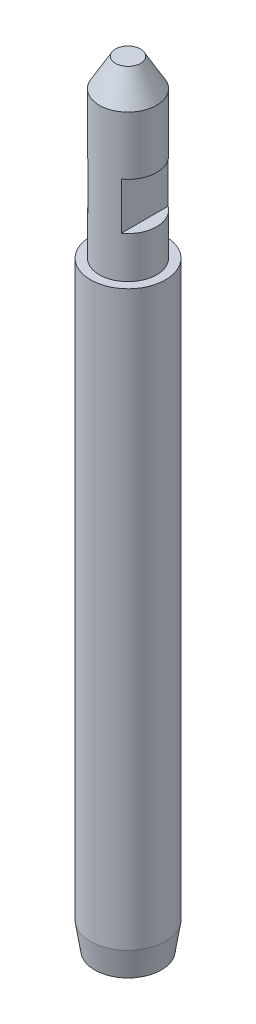
ISO-10303-21;
HEADER;
FILE_DESCRIPTION(('STEP AP214'),'2;1');
FILE_NAME('part.step','',(''),(''),'','','');
FILE_SCHEMA(('AUTOMOTIVE_DESIGN { 1 0 10303 214 1 1 1 1 }'));
ENDSEC;
DATA;
#1=APPLICATION_CONTEXT('core data for automotive mechanical design processes');
#2=APPLICATION_PROTOCOL_DEFINITION('international standard','automotive_design',2000,#1);
#3=PRODUCT_CONTEXT('',#1,'mechanical');
#4=PRODUCT('Part','Part','',(#3));
#5=PRODUCT_RELATED_PRODUCT_CATEGORY('part','',(#4));
#6=PRODUCT_DEFINITION_FORMATION('','',#4);
#7=PRODUCT_DEFINITION_CONTEXT('part definition',#1,'design');
#8=PRODUCT_DEFINITION('design','',#6,#7);
#9=PRODUCT_DEFINITION_SHAPE('','',#8);
#10=(LENGTH_UNIT() NAMED_UNIT(*) SI_UNIT(.MILLI.,.METRE.));
#11=(NAMED_UNIT(*) PLANE_ANGLE_UNIT() SI_UNIT($,.RADIAN.));
#12=(NAMED_UNIT(*) SI_UNIT($,.STERADIAN.) SOLID_ANGLE_UNIT());
#13=UNCERTAINTY_MEASURE_WITH_UNIT(LENGTH_MEASURE(1.E-05),#10,'distance_accuracy_value','');
#14=(GEOMETRIC_REPRESENTATION_CONTEXT(3) GLOBAL_UNCERTAINTY_ASSIGNED_CONTEXT((#13)) GLOBAL_UNIT_ASSIGNED_CONTEXT((#10,
#11,#12)) REPRESENTATION_CONTEXT('',''));
#15=CARTESIAN_POINT('',(0.,0.,0.));
#16=DIRECTION('',(0.,0.,1.));
#17=DIRECTION('',(1.,0.,0.));
#18=AXIS2_PLACEMENT_3D('',#15,#16,#17);
#19=CARTESIAN_POINT('',(-101.691044353421,123.,0.));
#20=DIRECTION('',(0.,-1.,0.));
#21=DIRECTION('',(0.,0.,-1.));
#22=AXIS2_PLACEMENT_3D('',#19,#20,#21);
#23=PLANE('',#22);
#24=CARTESIAN_POINT('',(-100.191044353421,123.,0.));
#25=DIRECTION('',(0.,-1.,0.));
#26=DIRECTION('',(0.,0.,-1.));
#27=AXIS2_PLACEMENT_3D('',#24,#25,#26);
#28=CIRCLE('',#27,1.50000000000002);
#29=CARTESIAN_POINT('',(-100.191044353421,123.,-1.50000000000002));
#30=VERTEX_POINT('',#29);
#31=EDGE_CURVE('E100',#30,#30,#28,.T.);
#32=ORIENTED_EDGE('',*,*,#31,.F.);
#33=EDGE_LOOP('',(#32));
#34=FACE_BOUND('',#33,.T.);
#35=ADVANCED_FACE('F33',(#34),#23,.F.);
#36=CARTESIAN_POINT('',(-100.191044353421,123.,0.));
#37=DIRECTION('',(0.,-1.,0.));
#38=DIRECTION('',(0.,0.,-1.));
#39=AXIS2_PLACEMENT_3D('',#36,#37,#38);
#40=CONICAL_SURFACE('',#39,1.50000000000002,0.523598775598304);
#41=CARTESIAN_POINT('',(-100.191044353421,119.622500925241,0.));
#42=DIRECTION('',(0.,-1.,0.));
#43=DIRECTION('',(0.,0.,-1.));
#44=AXIS2_PLACEMENT_3D('',#41,#42,#43);
#45=CIRCLE('',#44,3.45000000000001);
#46=CARTESIAN_POINT('',(-100.191044353421,119.622500925241,-3.45000000000001));
#47=VERTEX_POINT('',#46);
#48=EDGE_CURVE('E103',#47,#47,#45,.T.);
#49=ORIENTED_EDGE('',*,*,#48,.F.);
#50=EDGE_LOOP('',(#49));
#51=FACE_BOUND('',#50,.T.);
#52=ORIENTED_EDGE('',*,*,#31,.T.);
#53=EDGE_LOOP('',(#52));
#54=FACE_BOUND('',#53,.T.);
#55=ADVANCED_FACE('F141',(#51,#54),#40,.T.);
#56=CARTESIAN_POINT('',(-100.191044353421,30.,0.));
#57=DIRECTION('',(0.,-1.,0.));
#58=DIRECTION('',(0.,0.,-1.));
#59=AXIS2_PLACEMENT_3D('',#56,#57,#58);
#60=CYLINDRICAL_SURFACE('',#59,3.45000000000001);
#61=DIRECTION('',(0.,-1.,0.));
#62=VECTOR('',#61,1.);
#63=CARTESIAN_POINT('',(-98.191044353421,30.,-2.81113855937413));
#64=LINE('',#63,#62);
#65=CARTESIAN_POINT('',(-98.191044353421,112.635783233652,-2.81113855937413));
#66=VERTEX_POINT('',#65);
#67=CARTESIAN_POINT('',(-98.191044353421,107.,-2.81113855937413));
#68=VERTEX_POINT('',#67);
#69=EDGE_CURVE('E40',#66,#68,#64,.T.);
#70=ORIENTED_EDGE('',*,*,#69,.T.);
#71=CARTESIAN_POINT('',(-100.191044353421,107.,0.));
#72=DIRECTION('',(0.,-1.,0.));
#73=DIRECTION('',(0.,0.,-1.));
#74=AXIS2_PLACEMENT_3D('',#71,#72,#73);
#75=CIRCLE('',#74,3.45000000000001);
#76=CARTESIAN_POINT('',(-98.191044353421,107.,2.81113855937413));
#77=VERTEX_POINT('',#76);
#78=EDGE_CURVE('E11',#68,#77,#75,.T.);
#79=ORIENTED_EDGE('',*,*,#78,.T.);
#80=DIRECTION('',(0.,-1.,0.));
#81=VECTOR('',#80,1.);
#82=CARTESIAN_POINT('',(-98.191044353421,30.,2.81113855937413));
#83=LINE('',#82,#81);
#84=CARTESIAN_POINT('',(-98.191044353421,112.635783233652,2.81113855937413));
#85=VERTEX_POINT('',#84);
#86=EDGE_CURVE('E76',#77,#85,#83,.F.);
#87=ORIENTED_EDGE('',*,*,#86,.T.);
#88=CARTESIAN_POINT('',(-100.191044353421,112.635783233652,0.));
#89=DIRECTION('',(0.,1.,0.));
#90=DIRECTION('',(0.,0.,1.));
#91=AXIS2_PLACEMENT_3D('',#88,#89,#90);
#92=CIRCLE('',#91,3.45000000000001);
#93=EDGE_CURVE('E71',#85,#66,#92,.T.);
#94=ORIENTED_EDGE('',*,*,#93,.T.);
#95=EDGE_LOOP('',(#70,#79,#87,#94));
#96=FACE_BOUND('',#95,.T.);
#97=DIRECTION('',(0.,-1.,0.));
#98=VECTOR('',#97,1.);
#99=CARTESIAN_POINT('',(-102.191044353421,30.,-2.81113855937413));
#100=LINE('',#99,#98);
#101=CARTESIAN_POINT('',(-102.191044353421,107.,-2.81113855937413));
#102=VERTEX_POINT('',#101);
#103=CARTESIAN_POINT('',(-102.191044353421,112.635783233652,-2.81113855937413));
#104=VERTEX_POINT('',#103);
#105=EDGE_CURVE('E94',#102,#104,#100,.F.);
#106=ORIENTED_EDGE('',*,*,#105,.T.);
#107=CARTESIAN_POINT('',(-100.191044353421,112.635783233652,0.));
#108=DIRECTION('',(0.,1.,0.));
#109=DIRECTION('',(0.,0.,1.));
#110=AXIS2_PLACEMENT_3D('',#107,#108,#109);
#111=CIRCLE('',#110,3.45000000000001);
#112=CARTESIAN_POINT('',(-102.191044353421,112.635783233652,2.81113855937413));
#113=VERTEX_POINT('',#112);
#114=EDGE_CURVE('E77',#104,#113,#111,.T.);
#115=ORIENTED_EDGE('',*,*,#114,.T.);
#116=DIRECTION('',(0.,-1.,0.));
#117=VECTOR('',#116,1.);
#118=CARTESIAN_POINT('',(-102.191044353421,30.,2.81113855937413));
#119=LINE('',#118,#117);
#120=CARTESIAN_POINT('',(-102.191044353421,107.,2.81113855937413));
#121=VERTEX_POINT('',#120);
#122=EDGE_CURVE('E91',#113,#121,#119,.T.);
#123=ORIENTED_EDGE('',*,*,#122,.T.);
#124=CARTESIAN_POINT('',(-100.191044353421,107.,0.));
#125=DIRECTION('',(0.,-1.,0.));
#126=DIRECTION('',(0.,0.,-1.));
#127=AXIS2_PLACEMENT_3D('',#124,#125,#126);
#128=CIRCLE('',#127,3.45000000000001);
#129=EDGE_CURVE('E97',#121,#102,#128,.T.);
#130=ORIENTED_EDGE('',*,*,#129,.T.);
#131=EDGE_LOOP('',(#106,#115,#123,#130));
#132=FACE_BOUND('',#131,.T.);
#133=CARTESIAN_POINT('',(-100.191044353421,102.,0.));
#134=DIRECTION('',(0.,-1.,0.));
#135=DIRECTION('',(0.,0.,-1.));
#136=AXIS2_PLACEMENT_3D('',#133,#134,#135);
#137=CIRCLE('',#136,3.45000000000001);
#138=CARTESIAN_POINT('',(-100.191044353421,102.,-3.45000000000001));
#139=VERTEX_POINT('',#138);
#140=EDGE_CURVE('E106',#139,#139,#137,.T.);
#141=ORIENTED_EDGE('',*,*,#140,.F.);
#142=EDGE_LOOP('',(#141));
#143=FACE_BOUND('',#142,.T.);
#144=ORIENTED_EDGE('',*,*,#48,.T.);
#145=EDGE_LOOP('',(#144));
#146=FACE_BOUND('',#145,.T.);
#147=ADVANCED_FACE('F85',(#96,#132,#143,#146),#60,.T.);
#148=CARTESIAN_POINT('',(-103.641044353421,102.,0.));
#149=DIRECTION('',(0.,-1.,0.));
#150=DIRECTION('',(0.,0.,-1.));
#151=AXIS2_PLACEMENT_3D('',#148,#149,#150);
#152=PLANE('',#151);
#153=CARTESIAN_POINT('',(-100.191044353421,102.,0.));
#154=DIRECTION('',(0.,-1.,0.));
#155=DIRECTION('',(0.,0.,-1.));
#156=AXIS2_PLACEMENT_3D('',#153,#154,#155);
#157=CIRCLE('',#156,4.5);
#158=CARTESIAN_POINT('',(-100.191044353421,102.,-4.5));
#159=VERTEX_POINT('',#158);
#160=EDGE_CURVE('E109',#159,#159,#157,.T.);
#161=ORIENTED_EDGE('',*,*,#160,.F.);
#162=EDGE_LOOP('',(#161));
#163=FACE_BOUND('',#162,.T.);
#164=ORIENTED_EDGE('',*,*,#140,.T.);
#165=EDGE_LOOP('',(#164));
#166=FACE_BOUND('',#165,.T.);
#167=ADVANCED_FACE('F152',(#163,#166),#152,.F.);
#168=CARTESIAN_POINT('',(-100.191044353421,30.,0.));
#169=DIRECTION('',(0.,-1.,0.));
#170=DIRECTION('',(0.,0.,-1.));
#171=AXIS2_PLACEMENT_3D('',#168,#169,#170);
#172=CYLINDRICAL_SURFACE('',#171,4.5);
#173=CARTESIAN_POINT('',(-100.191044353421,33.2188285124329,0.));
#174=DIRECTION('',(0.,-1.,0.));
#175=DIRECTION('',(0.,0.,-1.));
#176=AXIS2_PLACEMENT_3D('',#173,#174,#175);
#177=CIRCLE('',#176,4.5);
#178=CARTESIAN_POINT('',(-100.191044353421,33.2188285124329,-4.5));
#179=VERTEX_POINT('',#178);
#180=EDGE_CURVE('E112',#179,#179,#177,.T.);
#181=ORIENTED_EDGE('',*,*,#180,.F.);
#182=EDGE_LOOP('',(#181));
#183=FACE_BOUND('',#182,.T.);
#184=ORIENTED_EDGE('',*,*,#160,.T.);
#185=EDGE_LOOP('',(#184));
#186=FACE_BOUND('',#185,.T.);
#187=ADVANCED_FACE('F158',(#183,#186),#172,.T.);
#188=CARTESIAN_POINT('',(-100.191044353421,33.2188285124329,0.));
#189=DIRECTION('',(0.,1.,0.));
#190=DIRECTION('',(0.,0.,1.));
#191=AXIS2_PLACEMENT_3D('',#188,#189,#190);
#192=CONICAL_SURFACE('',#191,4.5,0.152554500151755);
#193=CARTESIAN_POINT('',(-100.191044353421,30.,0.));
#194=DIRECTION('',(0.,-1.,0.));
#195=DIRECTION('',(0.,0.,-1.));
#196=AXIS2_PLACEMENT_3D('',#193,#194,#195);
#197=CIRCLE('',#196,4.00510806928564);
#198=CARTESIAN_POINT('',(-100.191044353421,30.,-4.00510806928564));
#199=VERTEX_POINT('',#198);
#200=EDGE_CURVE('E115',#199,#199,#197,.T.);
#201=ORIENTED_EDGE('',*,*,#200,.F.);
#202=EDGE_LOOP('',(#201));
#203=FACE_BOUND('',#202,.T.);
#204=ORIENTED_EDGE('',*,*,#180,.T.);
#205=EDGE_LOOP('',(#204));
#206=FACE_BOUND('',#205,.T.);
#207=ADVANCED_FACE('F162',(#203,#206),#192,.T.);
#208=CARTESIAN_POINT('',(-100.191044353421,30.,0.));
#209=DIRECTION('',(0.,1.,0.));
#210=DIRECTION('',(0.,0.,1.));
#211=AXIS2_PLACEMENT_3D('',#208,#209,#210);
#212=PLANE('',#211);
#213=CARTESIAN_POINT('',(-100.191044353421,30.,0.));
#214=DIRECTION('',(0.,-1.,0.));
#215=DIRECTION('',(0.,0.,-1.));
#216=AXIS2_PLACEMENT_3D('',#213,#214,#215);
#217=CIRCLE('',#216,1.60000000000001);
#218=CARTESIAN_POINT('',(-100.191044353421,30.,-1.60000000000001));
#219=VERTEX_POINT('',#218);
#220=EDGE_CURVE('E121',#219,#219,#217,.T.);
#221=ORIENTED_EDGE('',*,*,#220,.F.);
#222=EDGE_LOOP('',(#221));
#223=FACE_BOUND('',#222,.T.);
#224=ORIENTED_EDGE('',*,*,#200,.T.);
#225=EDGE_LOOP('',(#224));
#226=FACE_BOUND('',#225,.T.);
#227=ADVANCED_FACE('F166',(#223,#226),#212,.F.);
#228=CARTESIAN_POINT('',(-100.191044353421,40.,0.));
#229=DIRECTION('',(0.,-1.,0.));
#230=DIRECTION('',(0.,0.,-1.));
#231=AXIS2_PLACEMENT_3D('',#228,#229,#230);
#232=CYLINDRICAL_SURFACE('',#231,1.60000000000001);
#233=CARTESIAN_POINT('',(-100.191044353421,40.,0.));
#234=DIRECTION('',(0.,-1.,0.));
#235=DIRECTION('',(0.,0.,-1.));
#236=AXIS2_PLACEMENT_3D('',#233,#234,#235);
#237=CIRCLE('',#236,1.60000000000001);
#238=CARTESIAN_POINT('',(-100.191044353421,40.,-1.60000000000001));
#239=VERTEX_POINT('',#238);
#240=EDGE_CURVE('E118',#239,#239,#237,.T.);
#241=ORIENTED_EDGE('',*,*,#240,.F.);
#242=EDGE_LOOP('',(#241));
#243=FACE_BOUND('',#242,.T.);
#244=ORIENTED_EDGE('',*,*,#220,.T.);
#245=EDGE_LOOP('',(#244));
#246=FACE_BOUND('',#245,.T.);
#247=ADVANCED_FACE('F170',(#243,#246),#232,.F.);
#248=CARTESIAN_POINT('',(-100.191044353421,40.,0.));
#249=DIRECTION('',(0.,-1.,0.));
#250=DIRECTION('',(0.,0.,-1.));
#251=AXIS2_PLACEMENT_3D('',#248,#249,#250);
#252=PLANE('',#251);
#253=ORIENTED_EDGE('',*,*,#240,.T.);
#254=EDGE_LOOP('',(#253));
#255=FACE_BOUND('',#254,.T.);
#256=ADVANCED_FACE('F174',(#255),#252,.T.);
#257=CARTESIAN_POINT('',(-105.084467771351,112.635783233652,-5.5));
#258=DIRECTION('',(0.,1.,0.));
#259=DIRECTION('',(0.,0.,1.));
#260=AXIS2_PLACEMENT_3D('',#257,#258,#259);
#261=PLANE('',#260);
#262=DIRECTION('',(0.,0.,1.));
#263=VECTOR('',#262,1.);
#264=CARTESIAN_POINT('',(-102.191044353421,112.635783233652,-5.5));
#265=LINE('',#264,#263);
#266=EDGE_CURVE('E124',#104,#113,#265,.T.);
#267=ORIENTED_EDGE('',*,*,#266,.T.);
#268=ORIENTED_EDGE('',*,*,#114,.F.);
#269=EDGE_LOOP('',(#267,#268));
#270=FACE_BOUND('',#269,.T.);
#271=ADVANCED_FACE('F177',(#270),#261,.F.);
#272=CARTESIAN_POINT('',(-102.191044353421,112.635783233652,-5.5));
#273=DIRECTION('',(1.,0.,0.));
#274=DIRECTION('',(0.,0.,-1.));
#275=AXIS2_PLACEMENT_3D('',#272,#273,#274);
#276=PLANE('',#275);
#277=ORIENTED_EDGE('',*,*,#266,.F.);
#278=ORIENTED_EDGE('',*,*,#105,.F.);
#279=DIRECTION('',(0.,0.,1.));
#280=VECTOR('',#279,1.);
#281=CARTESIAN_POINT('',(-102.191044353421,107.,-5.5));
#282=LINE('',#281,#280);
#283=EDGE_CURVE('E53',#102,#121,#282,.T.);
#284=ORIENTED_EDGE('',*,*,#283,.T.);
#285=ORIENTED_EDGE('',*,*,#122,.F.);
#286=EDGE_LOOP('',(#277,#278,#284,#285));
#287=FACE_BOUND('',#286,.T.);
#288=ADVANCED_FACE('F138',(#287),#276,.F.);
#289=CARTESIAN_POINT('',(-105.084467771351,107.,-5.5));
#290=DIRECTION('',(0.,-1.,0.));
#291=DIRECTION('',(0.,0.,-1.));
#292=AXIS2_PLACEMENT_3D('',#289,#290,#291);
#293=PLANE('',#292);
#294=ORIENTED_EDGE('',*,*,#283,.F.);
#295=ORIENTED_EDGE('',*,*,#129,.F.);
#296=EDGE_LOOP('',(#294,#295));
#297=FACE_BOUND('',#296,.T.);
#298=ADVANCED_FACE('F131',(#297),#293,.F.);
#299=CARTESIAN_POINT('',(-95.2976209354913,107.,-5.5));
#300=DIRECTION('',(0.,-1.,0.));
#301=DIRECTION('',(0.,0.,-1.));
#302=AXIS2_PLACEMENT_3D('',#299,#300,#301);
#303=PLANE('',#302);
#304=DIRECTION('',(0.,0.,1.));
#305=VECTOR('',#304,1.);
#306=CARTESIAN_POINT('',(-98.191044353421,107.,-5.5));
#307=LINE('',#306,#305);
#308=EDGE_CURVE('E83',#68,#77,#307,.T.);
#309=ORIENTED_EDGE('',*,*,#308,.T.);
#310=ORIENTED_EDGE('',*,*,#78,.F.);
#311=EDGE_LOOP('',(#309,#310));
#312=FACE_BOUND('',#311,.T.);
#313=ADVANCED_FACE('F129',(#312),#303,.F.);
#314=CARTESIAN_POINT('',(-98.191044353421,112.635783233652,-5.5));
#315=DIRECTION('',(-1.,0.,0.));
#316=DIRECTION('',(0.,0.,1.));
#317=AXIS2_PLACEMENT_3D('',#314,#315,#316);
#318=PLANE('',#317);
#319=DIRECTION('',(0.,0.,1.));
#320=VECTOR('',#319,1.);
#321=CARTESIAN_POINT('',(-98.191044353421,112.635783233652,-5.5));
#322=LINE('',#321,#320);
#323=EDGE_CURVE('E46',#66,#85,#322,.T.);
#324=ORIENTED_EDGE('',*,*,#323,.T.);
#325=ORIENTED_EDGE('',*,*,#86,.F.);
#326=ORIENTED_EDGE('',*,*,#308,.F.);
#327=ORIENTED_EDGE('',*,*,#69,.F.);
#328=EDGE_LOOP('',(#324,#325,#326,#327));
#329=FACE_BOUND('',#328,.T.);
#330=ADVANCED_FACE('F80',(#329),#318,.F.);
#331=CARTESIAN_POINT('',(-95.2976209354913,112.635783233652,-5.5));
#332=DIRECTION('',(0.,1.,0.));
#333=DIRECTION('',(0.,0.,1.));
#334=AXIS2_PLACEMENT_3D('',#331,#332,#333);
#335=PLANE('',#334);
#336=ORIENTED_EDGE('',*,*,#323,.F.);
#337=ORIENTED_EDGE('',*,*,#93,.F.);
#338=EDGE_LOOP('',(#336,#337));
#339=FACE_BOUND('',#338,.T.);
#340=ADVANCED_FACE('F72',(#339),#335,.F.);
#341=CLOSED_SHELL('',(#35,#55,#147,#167,#187,#207,#227,#247,#256,#271,#288,#298,#313,#330,#340));
#342=MANIFOLD_SOLID_BREP('B2',#341);
#343=ADVANCED_BREP_SHAPE_REPRESENTATION('',(#18,#342),#14);
#344=SHAPE_DEFINITION_REPRESENTATION(#9,#343);
ENDSEC;
END-ISO-10303-21;
